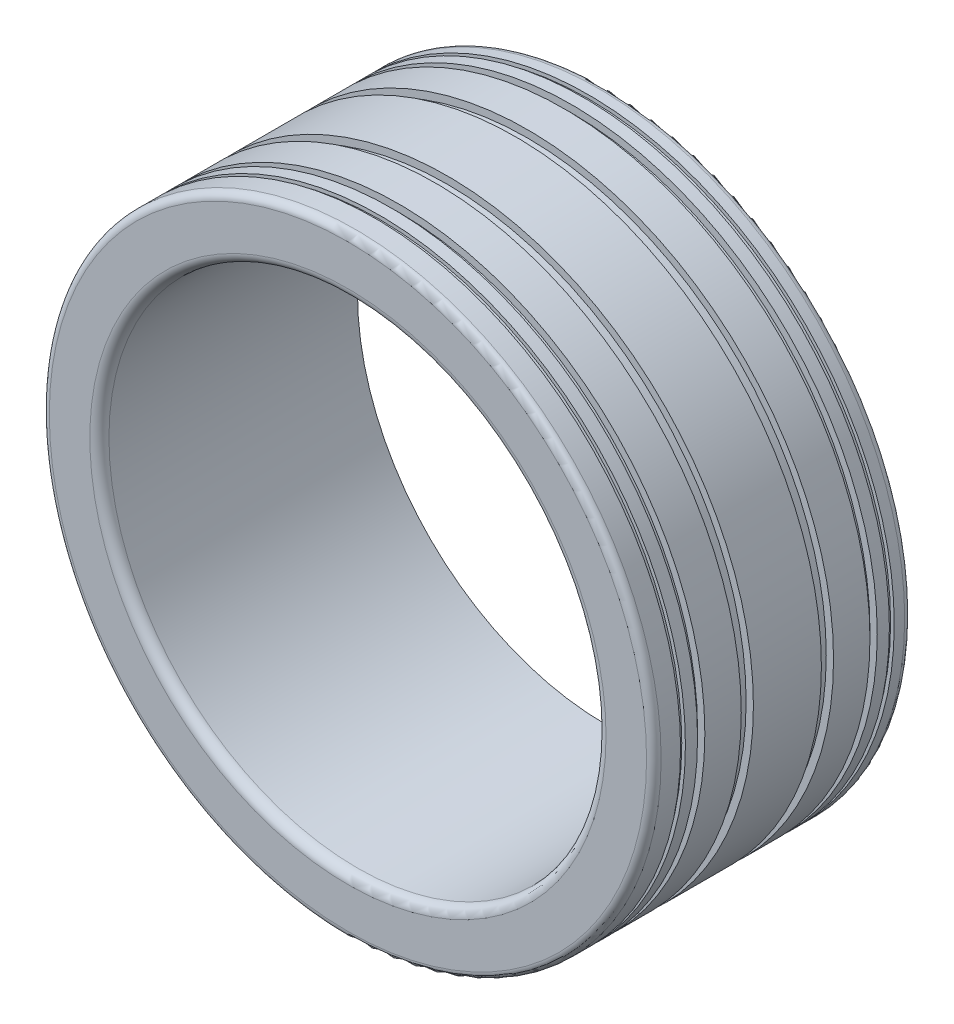
ISO-10303-21;
HEADER;
FILE_DESCRIPTION(('STEP AP214'),'2;1');
FILE_NAME('part.step','',(''),(''),'','','');
FILE_SCHEMA(('AUTOMOTIVE_DESIGN { 1 0 10303 214 1 1 1 1 }'));
ENDSEC;
DATA;
#1=APPLICATION_CONTEXT('core data for automotive mechanical design processes');
#2=APPLICATION_PROTOCOL_DEFINITION('international standard','automotive_design',2000,#1);
#3=PRODUCT_CONTEXT('',#1,'mechanical');
#4=PRODUCT('Part','Part','',(#3));
#5=PRODUCT_RELATED_PRODUCT_CATEGORY('part','',(#4));
#6=PRODUCT_DEFINITION_FORMATION('','',#4);
#7=PRODUCT_DEFINITION_CONTEXT('part definition',#1,'design');
#8=PRODUCT_DEFINITION('design','',#6,#7);
#9=PRODUCT_DEFINITION_SHAPE('','',#8);
#10=(LENGTH_UNIT() NAMED_UNIT(*) SI_UNIT(.MILLI.,.METRE.));
#11=(NAMED_UNIT(*) PLANE_ANGLE_UNIT() SI_UNIT($,.RADIAN.));
#12=(NAMED_UNIT(*) SI_UNIT($,.STERADIAN.) SOLID_ANGLE_UNIT());
#13=UNCERTAINTY_MEASURE_WITH_UNIT(LENGTH_MEASURE(1.E-05),#10,'distance_accuracy_value','');
#14=(GEOMETRIC_REPRESENTATION_CONTEXT(3) GLOBAL_UNCERTAINTY_ASSIGNED_CONTEXT((#13)) GLOBAL_UNIT_ASSIGNED_CONTEXT((#10,
#11,#12)) REPRESENTATION_CONTEXT('',''));
#15=CARTESIAN_POINT('',(0.,0.,0.));
#16=DIRECTION('',(0.,0.,1.));
#17=DIRECTION('',(1.,0.,0.));
#18=AXIS2_PLACEMENT_3D('',#15,#16,#17);
#19=CARTESIAN_POINT('',(0.,0.,-27.));
#20=DIRECTION('',(0.,0.,1.));
#21=DIRECTION('',(1.,0.,0.));
#22=AXIS2_PLACEMENT_3D('',#19,#20,#21);
#23=CYLINDRICAL_SURFACE('',#22,32.);
#24=CARTESIAN_POINT('',(0.,0.,-0.761999999999999));
#25=DIRECTION('',(0.,0.,1.));
#26=DIRECTION('',(1.,0.,0.));
#27=AXIS2_PLACEMENT_3D('',#24,#25,#26);
#28=CIRCLE('',#27,32.);
#29=CARTESIAN_POINT('',(32.,0.,-0.761999999999999));
#30=VERTEX_POINT('',#29);
#31=EDGE_CURVE('E56',#30,#30,#28,.F.);
#32=ORIENTED_EDGE('',*,*,#31,.T.);
#33=EDGE_LOOP('',(#32));
#34=FACE_BOUND('',#33,.T.);
#35=CARTESIAN_POINT('',(0.,0.,-2.794));
#36=DIRECTION('',(0.,0.,1.));
#37=DIRECTION('',(1.,0.,0.));
#38=AXIS2_PLACEMENT_3D('',#35,#36,#37);
#39=CIRCLE('',#38,32.);
#40=CARTESIAN_POINT('',(32.,0.,-2.794));
#41=VERTEX_POINT('',#40);
#42=EDGE_CURVE('E131',#41,#41,#39,.T.);
#43=ORIENTED_EDGE('',*,*,#42,.T.);
#44=EDGE_LOOP('',(#43));
#45=FACE_BOUND('',#44,.T.);
#46=ADVANCED_FACE('F33',(#34,#45),#23,.T.);
#47=CARTESIAN_POINT('',(0.,0.,-4.572));
#48=DIRECTION('',(0.,0.,1.));
#49=DIRECTION('',(1.,0.,0.));
#50=AXIS2_PLACEMENT_3D('',#47,#48,#49);
#51=CIRCLE('',#50,32.);
#52=CARTESIAN_POINT('',(32.,0.,-4.572));
#53=VERTEX_POINT('',#52);
#54=EDGE_CURVE('E119',#53,#53,#51,.T.);
#55=ORIENTED_EDGE('',*,*,#54,.T.);
#56=EDGE_LOOP('',(#55));
#57=FACE_BOUND('',#56,.T.);
#58=CARTESIAN_POINT('',(0.,0.,-3.302));
#59=DIRECTION('',(0.,0.,1.));
#60=DIRECTION('',(1.,0.,0.));
#61=AXIS2_PLACEMENT_3D('',#58,#59,#60);
#62=CIRCLE('',#61,32.);
#63=CARTESIAN_POINT('',(32.,0.,-3.302));
#64=VERTEX_POINT('',#63);
#65=EDGE_CURVE('E128',#64,#64,#62,.T.);
#66=ORIENTED_EDGE('',*,*,#65,.F.);
#67=EDGE_LOOP('',(#66));
#68=FACE_BOUND('',#67,.T.);
#69=ADVANCED_FACE('F153',(#57,#68),#23,.T.);
#70=CARTESIAN_POINT('',(0.,0.,-9.144));
#71=DIRECTION('',(0.,0.,1.));
#72=DIRECTION('',(1.,0.,0.));
#73=AXIS2_PLACEMENT_3D('',#70,#71,#72);
#74=CIRCLE('',#73,32.);
#75=CARTESIAN_POINT('',(32.,0.,-9.144));
#76=VERTEX_POINT('',#75);
#77=EDGE_CURVE('E107',#76,#76,#74,.T.);
#78=ORIENTED_EDGE('',*,*,#77,.T.);
#79=EDGE_LOOP('',(#78));
#80=FACE_BOUND('',#79,.T.);
#81=CARTESIAN_POINT('',(0.,0.,-5.334));
#82=DIRECTION('',(0.,0.,1.));
#83=DIRECTION('',(1.,0.,0.));
#84=AXIS2_PLACEMENT_3D('',#81,#82,#83);
#85=CIRCLE('',#84,32.);
#86=CARTESIAN_POINT('',(32.,0.,-5.334));
#87=VERTEX_POINT('',#86);
#88=EDGE_CURVE('E116',#87,#87,#85,.T.);
#89=ORIENTED_EDGE('',*,*,#88,.F.);
#90=EDGE_LOOP('',(#89));
#91=FACE_BOUND('',#90,.T.);
#92=ADVANCED_FACE('F160',(#80,#91),#23,.T.);
#93=CARTESIAN_POINT('',(0.,0.,-17.526));
#94=DIRECTION('',(0.,0.,1.));
#95=DIRECTION('',(1.,0.,0.));
#96=AXIS2_PLACEMENT_3D('',#93,#94,#95);
#97=CIRCLE('',#96,32.);
#98=CARTESIAN_POINT('',(32.,0.,-17.526));
#99=VERTEX_POINT('',#98);
#100=EDGE_CURVE('E74',#99,#99,#97,.T.);
#101=ORIENTED_EDGE('',*,*,#100,.T.);
#102=EDGE_LOOP('',(#101));
#103=FACE_BOUND('',#102,.T.);
#104=CARTESIAN_POINT('',(0.,0.,-10.414));
#105=DIRECTION('',(0.,0.,1.));
#106=DIRECTION('',(1.,0.,0.));
#107=AXIS2_PLACEMENT_3D('',#104,#105,#106);
#108=CIRCLE('',#107,32.);
#109=CARTESIAN_POINT('',(32.,0.,-10.414));
#110=VERTEX_POINT('',#109);
#111=EDGE_CURVE('E98',#110,#110,#108,.T.);
#112=ORIENTED_EDGE('',*,*,#111,.F.);
#113=EDGE_LOOP('',(#112));
#114=FACE_BOUND('',#113,.T.);
#115=ADVANCED_FACE('F156',(#103,#114),#23,.T.);
#116=CARTESIAN_POINT('',(0.,0.,-23.368));
#117=DIRECTION('',(0.,0.,1.));
#118=DIRECTION('',(1.,0.,0.));
#119=AXIS2_PLACEMENT_3D('',#116,#117,#118);
#120=CIRCLE('',#119,32.);
#121=CARTESIAN_POINT('',(32.,0.,-23.368));
#122=VERTEX_POINT('',#121);
#123=EDGE_CURVE('E71',#122,#122,#120,.T.);
#124=ORIENTED_EDGE('',*,*,#123,.F.);
#125=EDGE_LOOP('',(#124));
#126=FACE_BOUND('',#125,.T.);
#127=CARTESIAN_POINT('',(0.,0.,-24.638));
#128=DIRECTION('',(0.,0.,1.));
#129=DIRECTION('',(1.,0.,0.));
#130=AXIS2_PLACEMENT_3D('',#127,#128,#129);
#131=CIRCLE('',#130,32.);
#132=CARTESIAN_POINT('',(32.,0.,-24.638));
#133=VERTEX_POINT('',#132);
#134=EDGE_CURVE('E86',#133,#133,#131,.T.);
#135=ORIENTED_EDGE('',*,*,#134,.T.);
#136=EDGE_LOOP('',(#135));
#137=FACE_BOUND('',#136,.T.);
#138=ADVANCED_FACE('F165',(#126,#137),#23,.T.);
#139=CARTESIAN_POINT('',(0.,0.,-26.238));
#140=DIRECTION('',(0.,0.,1.));
#141=DIRECTION('',(1.,0.,0.));
#142=AXIS2_PLACEMENT_3D('',#139,#140,#141);
#143=CIRCLE('',#142,32.);
#144=CARTESIAN_POINT('',(32.,0.,-26.238));
#145=VERTEX_POINT('',#144);
#146=EDGE_CURVE('E53',#145,#145,#143,.T.);
#147=ORIENTED_EDGE('',*,*,#146,.T.);
#148=EDGE_LOOP('',(#147));
#149=FACE_BOUND('',#148,.T.);
#150=CARTESIAN_POINT('',(0.,0.,-25.146));
#151=DIRECTION('',(0.,0.,1.));
#152=DIRECTION('',(1.,0.,0.));
#153=AXIS2_PLACEMENT_3D('',#150,#151,#152);
#154=CIRCLE('',#153,32.);
#155=CARTESIAN_POINT('',(32.,0.,-25.146));
#156=VERTEX_POINT('',#155);
#157=EDGE_CURVE('E95',#156,#156,#154,.T.);
#158=ORIENTED_EDGE('',*,*,#157,.F.);
#159=EDGE_LOOP('',(#158));
#160=FACE_BOUND('',#159,.T.);
#161=ADVANCED_FACE('F172',(#149,#160),#23,.T.);
#162=CARTESIAN_POINT('',(0.,0.,-22.606));
#163=DIRECTION('',(0.,0.,1.));
#164=DIRECTION('',(1.,0.,0.));
#165=AXIS2_PLACEMENT_3D('',#162,#163,#164);
#166=CIRCLE('',#165,32.);
#167=CARTESIAN_POINT('',(32.,0.,-22.606));
#168=VERTEX_POINT('',#167);
#169=EDGE_CURVE('E62',#168,#168,#166,.T.);
#170=ORIENTED_EDGE('',*,*,#169,.T.);
#171=EDGE_LOOP('',(#170));
#172=FACE_BOUND('',#171,.T.);
#173=CARTESIAN_POINT('',(0.,0.,-18.796));
#174=DIRECTION('',(0.,0.,1.));
#175=DIRECTION('',(1.,0.,0.));
#176=AXIS2_PLACEMENT_3D('',#173,#174,#175);
#177=CIRCLE('',#176,32.);
#178=CARTESIAN_POINT('',(32.,0.,-18.796));
#179=VERTEX_POINT('',#178);
#180=EDGE_CURVE('E83',#179,#179,#177,.T.);
#181=ORIENTED_EDGE('',*,*,#180,.F.);
#182=EDGE_LOOP('',(#181));
#183=FACE_BOUND('',#182,.T.);
#184=ADVANCED_FACE('F167',(#172,#183),#23,.T.);
#185=CARTESIAN_POINT('',(0.,0.,-27.));
#186=DIRECTION('',(0.,0.,1.));
#187=DIRECTION('',(1.,0.,0.));
#188=AXIS2_PLACEMENT_3D('',#185,#186,#187);
#189=PLANE('',#188);
#190=CARTESIAN_POINT('',(0.,0.,-27.));
#191=DIRECTION('',(0.,0.,1.));
#192=DIRECTION('',(1.,0.,0.));
#193=AXIS2_PLACEMENT_3D('',#190,#191,#192);
#194=CIRCLE('',#193,31.238);
#195=CARTESIAN_POINT('',(31.238,0.,-27.));
#196=VERTEX_POINT('',#195);
#197=EDGE_CURVE('E48',#196,#196,#194,.F.);
#198=ORIENTED_EDGE('',*,*,#197,.T.);
#199=EDGE_LOOP('',(#198));
#200=FACE_BOUND('',#199,.T.);
#201=CARTESIAN_POINT('',(0.,0.,-27.));
#202=DIRECTION('',(0.,0.,1.));
#203=DIRECTION('',(1.,0.,0.));
#204=AXIS2_PLACEMENT_3D('',#201,#202,#203);
#205=CIRCLE('',#204,26.);
#206=CARTESIAN_POINT('',(26.,0.,-27.));
#207=VERTEX_POINT('',#206);
#208=EDGE_CURVE('E59',#207,#207,#205,.T.);
#209=ORIENTED_EDGE('',*,*,#208,.T.);
#210=EDGE_LOOP('',(#209));
#211=FACE_BOUND('',#210,.T.);
#212=ADVANCED_FACE('F177',(#200,#211),#189,.F.);
#213=CARTESIAN_POINT('',(0.,0.,0.));
#214=DIRECTION('',(0.,0.,1.));
#215=DIRECTION('',(1.,0.,0.));
#216=AXIS2_PLACEMENT_3D('',#213,#214,#215);
#217=PLANE('',#216);
#218=CARTESIAN_POINT('',(0.,0.,0.));
#219=DIRECTION('',(0.,0.,1.));
#220=DIRECTION('',(1.,0.,0.));
#221=AXIS2_PLACEMENT_3D('',#218,#219,#220);
#222=CIRCLE('',#221,27.);
#223=CARTESIAN_POINT('',(27.,0.,0.));
#224=VERTEX_POINT('',#223);
#225=EDGE_CURVE('E10',#224,#224,#222,.F.);
#226=ORIENTED_EDGE('',*,*,#225,.T.);
#227=EDGE_LOOP('',(#226));
#228=FACE_BOUND('',#227,.T.);
#229=CARTESIAN_POINT('',(0.,0.,0.));
#230=DIRECTION('',(0.,0.,1.));
#231=DIRECTION('',(1.,0.,0.));
#232=AXIS2_PLACEMENT_3D('',#229,#230,#231);
#233=CIRCLE('',#232,31.238);
#234=CARTESIAN_POINT('',(31.238,0.,0.));
#235=VERTEX_POINT('',#234);
#236=EDGE_CURVE('E44',#235,#235,#233,.T.);
#237=ORIENTED_EDGE('',*,*,#236,.T.);
#238=EDGE_LOOP('',(#237));
#239=FACE_BOUND('',#238,.T.);
#240=ADVANCED_FACE('F183',(#228,#239),#217,.T.);
#241=CARTESIAN_POINT('',(0.,0.,-27.));
#242=DIRECTION('',(0.,0.,1.));
#243=DIRECTION('',(1.,0.,0.));
#244=AXIS2_PLACEMENT_3D('',#241,#242,#243);
#245=CYLINDRICAL_SURFACE('',#244,26.);
#246=CARTESIAN_POINT('',(0.,0.,-1.));
#247=DIRECTION('',(0.,0.,1.));
#248=DIRECTION('',(1.,0.,0.));
#249=AXIS2_PLACEMENT_3D('',#246,#247,#248);
#250=CIRCLE('',#249,26.);
#251=CARTESIAN_POINT('',(26.,0.,-1.));
#252=VERTEX_POINT('',#251);
#253=EDGE_CURVE('E40',#252,#252,#250,.T.);
#254=ORIENTED_EDGE('',*,*,#253,.T.);
#255=EDGE_LOOP('',(#254));
#256=FACE_BOUND('',#255,.T.);
#257=ORIENTED_EDGE('',*,*,#208,.F.);
#258=EDGE_LOOP('',(#257));
#259=FACE_BOUND('',#258,.T.);
#260=ADVANCED_FACE('F225',(#256,#259),#245,.F.);
#261=CARTESIAN_POINT('',(0.,0.,-26.238));
#262=DIRECTION('',(0.,0.,1.));
#263=DIRECTION('',(1.,0.,0.));
#264=AXIS2_PLACEMENT_3D('',#261,#262,#263);
#265=TOROIDAL_SURFACE('',#264,31.238,0.762);
#266=ORIENTED_EDGE('',*,*,#197,.F.);
#267=EDGE_LOOP('',(#266));
#268=FACE_BOUND('',#267,.T.);
#269=ORIENTED_EDGE('',*,*,#146,.F.);
#270=EDGE_LOOP('',(#269));
#271=FACE_BOUND('',#270,.T.);
#272=ADVANCED_FACE('F227',(#268,#271),#265,.T.);
#273=CARTESIAN_POINT('',(0.,0.,-0.761999999999999));
#274=DIRECTION('',(0.,0.,1.));
#275=DIRECTION('',(1.,0.,0.));
#276=AXIS2_PLACEMENT_3D('',#273,#274,#275);
#277=TOROIDAL_SURFACE('',#276,31.238,0.762);
#278=ORIENTED_EDGE('',*,*,#31,.F.);
#279=EDGE_LOOP('',(#278));
#280=FACE_BOUND('',#279,.T.);
#281=ORIENTED_EDGE('',*,*,#236,.F.);
#282=EDGE_LOOP('',(#281));
#283=FACE_BOUND('',#282,.T.);
#284=ADVANCED_FACE('F223',(#280,#283),#277,.T.);
#285=CARTESIAN_POINT('',(-32.,0.,-22.606));
#286=DIRECTION('',(0.,0.,-1.));
#287=DIRECTION('',(-1.,0.,0.));
#288=AXIS2_PLACEMENT_3D('',#285,#286,#287);
#289=PLANE('',#288);
#290=CARTESIAN_POINT('',(0.,0.,-22.606));
#291=DIRECTION('',(0.,0.,1.));
#292=DIRECTION('',(1.,0.,0.));
#293=AXIS2_PLACEMENT_3D('',#290,#291,#292);
#294=CIRCLE('',#293,31.238);
#295=CARTESIAN_POINT('',(31.238,0.,-22.606));
#296=VERTEX_POINT('',#295);
#297=EDGE_CURVE('E65',#296,#296,#294,.T.);
#298=ORIENTED_EDGE('',*,*,#297,.T.);
#299=EDGE_LOOP('',(#298));
#300=FACE_BOUND('',#299,.T.);
#301=ORIENTED_EDGE('',*,*,#169,.F.);
#302=EDGE_LOOP('',(#301));
#303=FACE_BOUND('',#302,.T.);
#304=ADVANCED_FACE('F219',(#300,#303),#289,.T.);
#305=CARTESIAN_POINT('',(0.,0.,0.));
#306=DIRECTION('',(0.,0.,1.));
#307=DIRECTION('',(1.,0.,0.));
#308=AXIS2_PLACEMENT_3D('',#305,#306,#307);
#309=CYLINDRICAL_SURFACE('',#308,31.238);
#310=CARTESIAN_POINT('',(0.,0.,-23.368));
#311=DIRECTION('',(0.,0.,1.));
#312=DIRECTION('',(1.,0.,0.));
#313=AXIS2_PLACEMENT_3D('',#310,#311,#312);
#314=CIRCLE('',#313,31.238);
#315=CARTESIAN_POINT('',(31.238,0.,-23.368));
#316=VERTEX_POINT('',#315);
#317=EDGE_CURVE('E68',#316,#316,#314,.T.);
#318=ORIENTED_EDGE('',*,*,#317,.T.);
#319=EDGE_LOOP('',(#318));
#320=FACE_BOUND('',#319,.T.);
#321=ORIENTED_EDGE('',*,*,#297,.F.);
#322=EDGE_LOOP('',(#321));
#323=FACE_BOUND('',#322,.T.);
#324=ADVANCED_FACE('F213',(#320,#323),#309,.T.);
#325=CARTESIAN_POINT('',(-32.,0.,-23.368));
#326=DIRECTION('',(0.,0.,1.));
#327=DIRECTION('',(1.,0.,0.));
#328=AXIS2_PLACEMENT_3D('',#325,#326,#327);
#329=PLANE('',#328);
#330=ORIENTED_EDGE('',*,*,#123,.T.);
#331=EDGE_LOOP('',(#330));
#332=FACE_BOUND('',#331,.T.);
#333=ORIENTED_EDGE('',*,*,#317,.F.);
#334=EDGE_LOOP('',(#333));
#335=FACE_BOUND('',#334,.T.);
#336=ADVANCED_FACE('F207',(#332,#335),#329,.T.);
#337=CARTESIAN_POINT('',(-32.,0.,-17.526));
#338=DIRECTION('',(0.,0.,-1.));
#339=DIRECTION('',(-1.,0.,0.));
#340=AXIS2_PLACEMENT_3D('',#337,#338,#339);
#341=PLANE('',#340);
#342=CARTESIAN_POINT('',(0.,0.,-17.526));
#343=DIRECTION('',(0.,0.,1.));
#344=DIRECTION('',(1.,0.,0.));
#345=AXIS2_PLACEMENT_3D('',#342,#343,#344);
#346=CIRCLE('',#345,31.238);
#347=CARTESIAN_POINT('',(31.238,0.,-17.526));
#348=VERTEX_POINT('',#347);
#349=EDGE_CURVE('E77',#348,#348,#346,.T.);
#350=ORIENTED_EDGE('',*,*,#349,.T.);
#351=EDGE_LOOP('',(#350));
#352=FACE_BOUND('',#351,.T.);
#353=ORIENTED_EDGE('',*,*,#100,.F.);
#354=EDGE_LOOP('',(#353));
#355=FACE_BOUND('',#354,.T.);
#356=ADVANCED_FACE('F201',(#352,#355),#341,.T.);
#357=CARTESIAN_POINT('',(0.,0.,0.));
#358=DIRECTION('',(0.,0.,1.));
#359=DIRECTION('',(1.,0.,0.));
#360=AXIS2_PLACEMENT_3D('',#357,#358,#359);
#361=CYLINDRICAL_SURFACE('',#360,31.238);
#362=CARTESIAN_POINT('',(0.,0.,-18.796));
#363=DIRECTION('',(0.,0.,1.));
#364=DIRECTION('',(1.,0.,0.));
#365=AXIS2_PLACEMENT_3D('',#362,#363,#364);
#366=CIRCLE('',#365,31.238);
#367=CARTESIAN_POINT('',(31.238,0.,-18.796));
#368=VERTEX_POINT('',#367);
#369=EDGE_CURVE('E80',#368,#368,#366,.T.);
#370=ORIENTED_EDGE('',*,*,#369,.T.);
#371=EDGE_LOOP('',(#370));
#372=FACE_BOUND('',#371,.T.);
#373=ORIENTED_EDGE('',*,*,#349,.F.);
#374=EDGE_LOOP('',(#373));
#375=FACE_BOUND('',#374,.T.);
#376=ADVANCED_FACE('F195',(#372,#375),#361,.T.);
#377=CARTESIAN_POINT('',(-32.,0.,-18.796));
#378=DIRECTION('',(0.,0.,1.));
#379=DIRECTION('',(1.,0.,0.));
#380=AXIS2_PLACEMENT_3D('',#377,#378,#379);
#381=PLANE('',#380);
#382=ORIENTED_EDGE('',*,*,#180,.T.);
#383=EDGE_LOOP('',(#382));
#384=FACE_BOUND('',#383,.T.);
#385=ORIENTED_EDGE('',*,*,#369,.F.);
#386=EDGE_LOOP('',(#385));
#387=FACE_BOUND('',#386,.T.);
#388=ADVANCED_FACE('F191',(#384,#387),#381,.T.);
#389=CARTESIAN_POINT('',(-32.,0.,-24.638));
#390=DIRECTION('',(0.,0.,-1.));
#391=DIRECTION('',(-1.,0.,0.));
#392=AXIS2_PLACEMENT_3D('',#389,#390,#391);
#393=PLANE('',#392);
#394=CARTESIAN_POINT('',(0.,0.,-24.638));
#395=DIRECTION('',(0.,0.,1.));
#396=DIRECTION('',(1.,0.,0.));
#397=AXIS2_PLACEMENT_3D('',#394,#395,#396);
#398=CIRCLE('',#397,31.619);
#399=CARTESIAN_POINT('',(31.619,0.,-24.638));
#400=VERTEX_POINT('',#399);
#401=EDGE_CURVE('E89',#400,#400,#398,.T.);
#402=ORIENTED_EDGE('',*,*,#401,.T.);
#403=EDGE_LOOP('',(#402));
#404=FACE_BOUND('',#403,.T.);
#405=ORIENTED_EDGE('',*,*,#134,.F.);
#406=EDGE_LOOP('',(#405));
#407=FACE_BOUND('',#406,.T.);
#408=ADVANCED_FACE('F194',(#404,#407),#393,.T.);
#409=CARTESIAN_POINT('',(0.,0.,0.));
#410=DIRECTION('',(0.,0.,1.));
#411=DIRECTION('',(1.,0.,0.));
#412=AXIS2_PLACEMENT_3D('',#409,#410,#411);
#413=CYLINDRICAL_SURFACE('',#412,31.619);
#414=CARTESIAN_POINT('',(0.,0.,-25.146));
#415=DIRECTION('',(0.,0.,1.));
#416=DIRECTION('',(1.,0.,0.));
#417=AXIS2_PLACEMENT_3D('',#414,#415,#416);
#418=CIRCLE('',#417,31.619);
#419=CARTESIAN_POINT('',(31.619,0.,-25.146));
#420=VERTEX_POINT('',#419);
#421=EDGE_CURVE('E92',#420,#420,#418,.T.);
#422=ORIENTED_EDGE('',*,*,#421,.T.);
#423=EDGE_LOOP('',(#422));
#424=FACE_BOUND('',#423,.T.);
#425=ORIENTED_EDGE('',*,*,#401,.F.);
#426=EDGE_LOOP('',(#425));
#427=FACE_BOUND('',#426,.T.);
#428=ADVANCED_FACE('F253',(#424,#427),#413,.T.);
#429=CARTESIAN_POINT('',(-32.,0.,-25.146));
#430=DIRECTION('',(0.,0.,1.));
#431=DIRECTION('',(1.,0.,0.));
#432=AXIS2_PLACEMENT_3D('',#429,#430,#431);
#433=PLANE('',#432);
#434=ORIENTED_EDGE('',*,*,#157,.T.);
#435=EDGE_LOOP('',(#434));
#436=FACE_BOUND('',#435,.T.);
#437=ORIENTED_EDGE('',*,*,#421,.F.);
#438=EDGE_LOOP('',(#437));
#439=FACE_BOUND('',#438,.T.);
#440=ADVANCED_FACE('F249',(#436,#439),#433,.T.);
#441=CARTESIAN_POINT('',(-32.,0.,-10.414));
#442=DIRECTION('',(0.,0.,1.));
#443=DIRECTION('',(1.,0.,0.));
#444=AXIS2_PLACEMENT_3D('',#441,#442,#443);
#445=PLANE('',#444);
#446=ORIENTED_EDGE('',*,*,#111,.T.);
#447=EDGE_LOOP('',(#446));
#448=FACE_BOUND('',#447,.T.);
#449=CARTESIAN_POINT('',(0.,0.,-10.414));
#450=DIRECTION('',(0.,0.,1.));
#451=DIRECTION('',(1.,0.,0.));
#452=AXIS2_PLACEMENT_3D('',#449,#450,#451);
#453=CIRCLE('',#452,31.238);
#454=CARTESIAN_POINT('',(31.238,0.,-10.414));
#455=VERTEX_POINT('',#454);
#456=EDGE_CURVE('E101',#455,#455,#453,.T.);
#457=ORIENTED_EDGE('',*,*,#456,.F.);
#458=EDGE_LOOP('',(#457));
#459=FACE_BOUND('',#458,.T.);
#460=ADVANCED_FACE('F252',(#448,#459),#445,.T.);
#461=CARTESIAN_POINT('',(0.,0.,0.));
#462=DIRECTION('',(0.,0.,1.));
#463=DIRECTION('',(1.,0.,0.));
#464=AXIS2_PLACEMENT_3D('',#461,#462,#463);
#465=CYLINDRICAL_SURFACE('',#464,31.238);
#466=ORIENTED_EDGE('',*,*,#456,.T.);
#467=EDGE_LOOP('',(#466));
#468=FACE_BOUND('',#467,.T.);
#469=CARTESIAN_POINT('',(0.,0.,-9.144));
#470=DIRECTION('',(0.,0.,1.));
#471=DIRECTION('',(1.,0.,0.));
#472=AXIS2_PLACEMENT_3D('',#469,#470,#471);
#473=CIRCLE('',#472,31.238);
#474=CARTESIAN_POINT('',(31.238,0.,-9.144));
#475=VERTEX_POINT('',#474);
#476=EDGE_CURVE('E104',#475,#475,#473,.T.);
#477=ORIENTED_EDGE('',*,*,#476,.F.);
#478=EDGE_LOOP('',(#477));
#479=FACE_BOUND('',#478,.T.);
#480=ADVANCED_FACE('F272',(#468,#479),#465,.T.);
#481=CARTESIAN_POINT('',(-32.,0.,-9.144));
#482=DIRECTION('',(0.,0.,-1.));
#483=DIRECTION('',(-1.,0.,0.));
#484=AXIS2_PLACEMENT_3D('',#481,#482,#483);
#485=PLANE('',#484);
#486=ORIENTED_EDGE('',*,*,#476,.T.);
#487=EDGE_LOOP('',(#486));
#488=FACE_BOUND('',#487,.T.);
#489=ORIENTED_EDGE('',*,*,#77,.F.);
#490=EDGE_LOOP('',(#489));
#491=FACE_BOUND('',#490,.T.);
#492=ADVANCED_FACE('F276',(#488,#491),#485,.T.);
#493=CARTESIAN_POINT('',(-32.,0.,-4.572));
#494=DIRECTION('',(0.,0.,-1.));
#495=DIRECTION('',(-1.,0.,0.));
#496=AXIS2_PLACEMENT_3D('',#493,#494,#495);
#497=PLANE('',#496);
#498=CARTESIAN_POINT('',(0.,0.,-4.572));
#499=DIRECTION('',(0.,0.,1.));
#500=DIRECTION('',(1.,0.,0.));
#501=AXIS2_PLACEMENT_3D('',#498,#499,#500);
#502=CIRCLE('',#501,31.238);
#503=CARTESIAN_POINT('',(31.238,0.,-4.572));
#504=VERTEX_POINT('',#503);
#505=EDGE_CURVE('E110',#504,#504,#502,.T.);
#506=ORIENTED_EDGE('',*,*,#505,.T.);
#507=EDGE_LOOP('',(#506));
#508=FACE_BOUND('',#507,.T.);
#509=ORIENTED_EDGE('',*,*,#54,.F.);
#510=EDGE_LOOP('',(#509));
#511=FACE_BOUND('',#510,.T.);
#512=ADVANCED_FACE('F280',(#508,#511),#497,.T.);
#513=CARTESIAN_POINT('',(0.,0.,0.));
#514=DIRECTION('',(0.,0.,1.));
#515=DIRECTION('',(1.,0.,0.));
#516=AXIS2_PLACEMENT_3D('',#513,#514,#515);
#517=CYLINDRICAL_SURFACE('',#516,31.238);
#518=CARTESIAN_POINT('',(0.,0.,-5.334));
#519=DIRECTION('',(0.,0.,1.));
#520=DIRECTION('',(1.,0.,0.));
#521=AXIS2_PLACEMENT_3D('',#518,#519,#520);
#522=CIRCLE('',#521,31.238);
#523=CARTESIAN_POINT('',(31.238,0.,-5.334));
#524=VERTEX_POINT('',#523);
#525=EDGE_CURVE('E113',#524,#524,#522,.T.);
#526=ORIENTED_EDGE('',*,*,#525,.T.);
#527=EDGE_LOOP('',(#526));
#528=FACE_BOUND('',#527,.T.);
#529=ORIENTED_EDGE('',*,*,#505,.F.);
#530=EDGE_LOOP('',(#529));
#531=FACE_BOUND('',#530,.T.);
#532=ADVANCED_FACE('F149',(#528,#531),#517,.T.);
#533=CARTESIAN_POINT('',(-32.,0.,-5.334));
#534=DIRECTION('',(0.,0.,1.));
#535=DIRECTION('',(1.,0.,0.));
#536=AXIS2_PLACEMENT_3D('',#533,#534,#535);
#537=PLANE('',#536);
#538=ORIENTED_EDGE('',*,*,#88,.T.);
#539=EDGE_LOOP('',(#538));
#540=FACE_BOUND('',#539,.T.);
#541=ORIENTED_EDGE('',*,*,#525,.F.);
#542=EDGE_LOOP('',(#541));
#543=FACE_BOUND('',#542,.T.);
#544=ADVANCED_FACE('F139',(#540,#543),#537,.T.);
#545=CARTESIAN_POINT('',(-32.,0.,-2.794));
#546=DIRECTION('',(0.,0.,-1.));
#547=DIRECTION('',(-1.,0.,0.));
#548=AXIS2_PLACEMENT_3D('',#545,#546,#547);
#549=PLANE('',#548);
#550=CARTESIAN_POINT('',(0.,0.,-2.794));
#551=DIRECTION('',(0.,0.,1.));
#552=DIRECTION('',(1.,0.,0.));
#553=AXIS2_PLACEMENT_3D('',#550,#551,#552);
#554=CIRCLE('',#553,31.619);
#555=CARTESIAN_POINT('',(31.619,0.,-2.794));
#556=VERTEX_POINT('',#555);
#557=EDGE_CURVE('E122',#556,#556,#554,.T.);
#558=ORIENTED_EDGE('',*,*,#557,.T.);
#559=EDGE_LOOP('',(#558));
#560=FACE_BOUND('',#559,.T.);
#561=ORIENTED_EDGE('',*,*,#42,.F.);
#562=EDGE_LOOP('',(#561));
#563=FACE_BOUND('',#562,.T.);
#564=ADVANCED_FACE('F136',(#560,#563),#549,.T.);
#565=CARTESIAN_POINT('',(0.,0.,0.));
#566=DIRECTION('',(0.,0.,1.));
#567=DIRECTION('',(1.,0.,0.));
#568=AXIS2_PLACEMENT_3D('',#565,#566,#567);
#569=CYLINDRICAL_SURFACE('',#568,31.619);
#570=CARTESIAN_POINT('',(0.,0.,-3.302));
#571=DIRECTION('',(0.,0.,1.));
#572=DIRECTION('',(1.,0.,0.));
#573=AXIS2_PLACEMENT_3D('',#570,#571,#572);
#574=CIRCLE('',#573,31.619);
#575=CARTESIAN_POINT('',(31.619,0.,-3.302));
#576=VERTEX_POINT('',#575);
#577=EDGE_CURVE('E125',#576,#576,#574,.T.);
#578=ORIENTED_EDGE('',*,*,#577,.T.);
#579=EDGE_LOOP('',(#578));
#580=FACE_BOUND('',#579,.T.);
#581=ORIENTED_EDGE('',*,*,#557,.F.);
#582=EDGE_LOOP('',(#581));
#583=FACE_BOUND('',#582,.T.);
#584=ADVANCED_FACE('F138',(#580,#583),#569,.T.);
#585=CARTESIAN_POINT('',(-32.,0.,-3.302));
#586=DIRECTION('',(0.,0.,1.));
#587=DIRECTION('',(1.,0.,0.));
#588=AXIS2_PLACEMENT_3D('',#585,#586,#587);
#589=PLANE('',#588);
#590=ORIENTED_EDGE('',*,*,#65,.T.);
#591=EDGE_LOOP('',(#590));
#592=FACE_BOUND('',#591,.T.);
#593=ORIENTED_EDGE('',*,*,#577,.F.);
#594=EDGE_LOOP('',(#593));
#595=FACE_BOUND('',#594,.T.);
#596=ADVANCED_FACE('F146',(#592,#595),#589,.T.);
#597=CARTESIAN_POINT('',(0.,0.,-1.));
#598=DIRECTION('',(0.,0.,1.));
#599=DIRECTION('',(1.,0.,0.));
#600=AXIS2_PLACEMENT_3D('',#597,#598,#599);
#601=TOROIDAL_SURFACE('',#600,27.,1.);
#602=ORIENTED_EDGE('',*,*,#225,.F.);
#603=EDGE_LOOP('',(#602));
#604=FACE_BOUND('',#603,.T.);
#605=ORIENTED_EDGE('',*,*,#253,.F.);
#606=EDGE_LOOP('',(#605));
#607=FACE_BOUND('',#606,.T.);
#608=ADVANCED_FACE('F35',(#604,#607),#601,.T.);
#609=CLOSED_SHELL('',(#46,#69,#92,#115,#138,#161,#184,#212,#240,#260,#272,#284,#304,#324,#336,
#356,#376,#388,#408,#428,#440,#460,#480,#492,#512,#532,#544,#564,#584,#596,#608));
#610=MANIFOLD_SOLID_BREP('B2',#609);
#611=ADVANCED_BREP_SHAPE_REPRESENTATION('',(#18,#610),#14);
#612=SHAPE_DEFINITION_REPRESENTATION(#9,#611);
ENDSEC;
END-ISO-10303-21;
